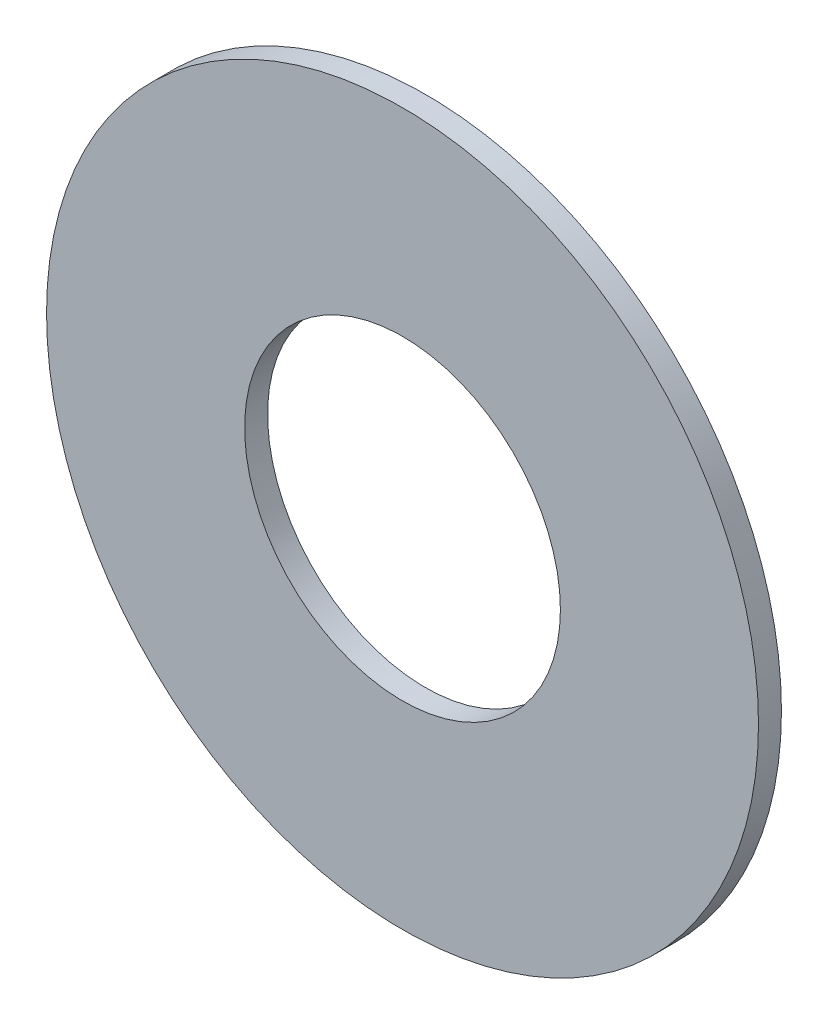
ISO-10303-21;
HEADER;
FILE_DESCRIPTION(('STEP AP214'),'2;1');
FILE_NAME('part.step','',(''),(''),'','','');
FILE_SCHEMA(('AUTOMOTIVE_DESIGN { 1 0 10303 214 1 1 1 1 }'));
ENDSEC;
DATA;
#1=APPLICATION_CONTEXT('core data for automotive mechanical design processes');
#2=APPLICATION_PROTOCOL_DEFINITION('international standard','automotive_design',2000,#1);
#3=PRODUCT_CONTEXT('',#1,'mechanical');
#4=PRODUCT('Part','Part','',(#3));
#5=PRODUCT_RELATED_PRODUCT_CATEGORY('part','',(#4));
#6=PRODUCT_DEFINITION_FORMATION('','',#4);
#7=PRODUCT_DEFINITION_CONTEXT('part definition',#1,'design');
#8=PRODUCT_DEFINITION('design','',#6,#7);
#9=PRODUCT_DEFINITION_SHAPE('','',#8);
#10=(LENGTH_UNIT() NAMED_UNIT(*) SI_UNIT(.MILLI.,.METRE.));
#11=(NAMED_UNIT(*) PLANE_ANGLE_UNIT() SI_UNIT($,.RADIAN.));
#12=(NAMED_UNIT(*) SI_UNIT($,.STERADIAN.) SOLID_ANGLE_UNIT());
#13=UNCERTAINTY_MEASURE_WITH_UNIT(LENGTH_MEASURE(1.E-05),#10,'distance_accuracy_value','');
#14=(GEOMETRIC_REPRESENTATION_CONTEXT(3) GLOBAL_UNCERTAINTY_ASSIGNED_CONTEXT((#13)) GLOBAL_UNIT_ASSIGNED_CONTEXT((#10,
#11,#12)) REPRESENTATION_CONTEXT('',''));
#15=CARTESIAN_POINT('',(0.,0.,0.));
#16=DIRECTION('',(0.,0.,1.));
#17=DIRECTION('',(1.,0.,0.));
#18=AXIS2_PLACEMENT_3D('',#15,#16,#17);
#19=CARTESIAN_POINT('',(16.1680379891016,23.8007187344124,1.));
#20=DIRECTION('',(0.,0.,-1.));
#21=DIRECTION('',(-1.,0.,0.));
#22=AXIS2_PLACEMENT_3D('',#19,#20,#21);
#23=PLANE('',#22);
#24=CARTESIAN_POINT('',(13.0580379891016,26.9107187344124,1.));
#25=DIRECTION('',(0.,0.,1.));
#26=DIRECTION('',(1.,0.,0.));
#27=AXIS2_PLACEMENT_3D('',#24,#25,#26);
#28=CIRCLE('',#27,1.375);
#29=CARTESIAN_POINT('',(14.4330379891016,26.9107187344124,1.));
#30=VERTEX_POINT('',#29);
#31=EDGE_CURVE('E27',#30,#30,#28,.F.);
#32=ORIENTED_EDGE('',*,*,#31,.F.);
#33=EDGE_LOOP('',(#32));
#34=FACE_BOUND('',#33,.T.);
#35=CARTESIAN_POINT('',(13.0580379891016,26.9107187344124,1.));
#36=DIRECTION('',(0.,0.,-1.));
#37=DIRECTION('',(-1.,0.,0.));
#38=AXIS2_PLACEMENT_3D('',#35,#36,#37);
#39=CIRCLE('',#38,3.1);
#40=CARTESIAN_POINT('',(9.9580379891016,26.9107187344124,1.));
#41=VERTEX_POINT('',#40);
#42=EDGE_CURVE('E18',#41,#41,#39,.F.);
#43=ORIENTED_EDGE('',*,*,#42,.F.);
#44=EDGE_LOOP('',(#43));
#45=FACE_BOUND('',#44,.T.);
#46=ADVANCED_FACE('F14',(#34,#45),#23,.T.);
#47=CARTESIAN_POINT('',(13.0580379891016,26.9107187344124,1.2));
#48=DIRECTION('',(0.,0.,-1.));
#49=DIRECTION('',(-1.,0.,0.));
#50=AXIS2_PLACEMENT_3D('',#47,#48,#49);
#51=CYLINDRICAL_SURFACE('',#50,3.1);
#52=ORIENTED_EDGE('',*,*,#42,.T.);
#53=EDGE_LOOP('',(#52));
#54=FACE_BOUND('',#53,.T.);
#55=CARTESIAN_POINT('',(13.0580379891016,26.9107187344124,1.2));
#56=DIRECTION('',(0.,0.,-1.));
#57=DIRECTION('',(-1.,0.,0.));
#58=AXIS2_PLACEMENT_3D('',#55,#56,#57);
#59=CIRCLE('',#58,3.1);
#60=CARTESIAN_POINT('',(9.9580379891016,26.9107187344124,1.2));
#61=VERTEX_POINT('',#60);
#62=EDGE_CURVE('E22',#61,#61,#59,.F.);
#63=ORIENTED_EDGE('',*,*,#62,.F.);
#64=EDGE_LOOP('',(#63));
#65=FACE_BOUND('',#64,.T.);
#66=ADVANCED_FACE('F35',(#54,#65),#51,.T.);
#67=CARTESIAN_POINT('',(13.0580379891016,26.9107187344124,1.));
#68=DIRECTION('',(0.,0.,1.));
#69=DIRECTION('',(1.,0.,0.));
#70=AXIS2_PLACEMENT_3D('',#67,#68,#69);
#71=CYLINDRICAL_SURFACE('',#70,1.375);
#72=ORIENTED_EDGE('',*,*,#31,.T.);
#73=EDGE_LOOP('',(#72));
#74=FACE_BOUND('',#73,.T.);
#75=CARTESIAN_POINT('',(13.0580379891016,26.9107187344124,1.2));
#76=DIRECTION('',(0.,0.,1.));
#77=DIRECTION('',(1.,0.,0.));
#78=AXIS2_PLACEMENT_3D('',#75,#76,#77);
#79=CIRCLE('',#78,1.375);
#80=CARTESIAN_POINT('',(14.4330379891016,26.9107187344124,1.2));
#81=VERTEX_POINT('',#80);
#82=EDGE_CURVE('E10',#81,#81,#79,.F.);
#83=ORIENTED_EDGE('',*,*,#82,.F.);
#84=EDGE_LOOP('',(#83));
#85=FACE_BOUND('',#84,.T.);
#86=ADVANCED_FACE('F45',(#74,#85),#71,.F.);
#87=CARTESIAN_POINT('',(9.9480379891016,23.8007187344124,1.2));
#88=DIRECTION('',(0.,0.,1.));
#89=DIRECTION('',(1.,0.,0.));
#90=AXIS2_PLACEMENT_3D('',#87,#88,#89);
#91=PLANE('',#90);
#92=ORIENTED_EDGE('',*,*,#82,.T.);
#93=EDGE_LOOP('',(#92));
#94=FACE_BOUND('',#93,.T.);
#95=ORIENTED_EDGE('',*,*,#62,.T.);
#96=EDGE_LOOP('',(#95));
#97=FACE_BOUND('',#96,.T.);
#98=ADVANCED_FACE('F16',(#94,#97),#91,.T.);
#99=CLOSED_SHELL('',(#46,#66,#86,#98));
#100=MANIFOLD_SOLID_BREP('B1',#99);
#101=ADVANCED_BREP_SHAPE_REPRESENTATION('',(#18,#100),#14);
#102=SHAPE_DEFINITION_REPRESENTATION(#9,#101);
ENDSEC;
END-ISO-10303-21;
